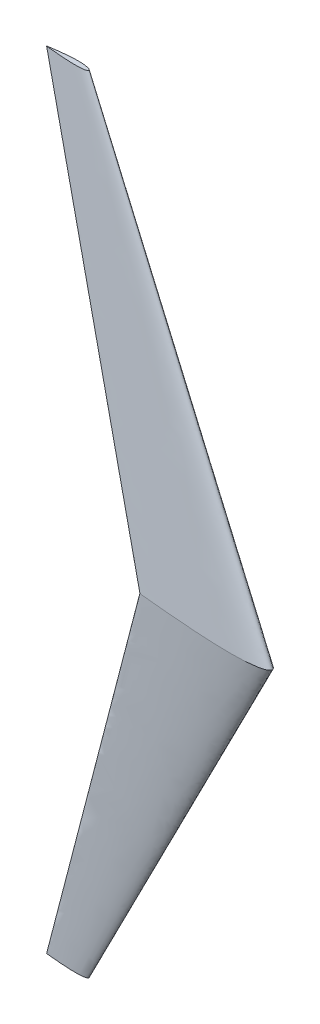
ISO-10303-21;
HEADER;
FILE_DESCRIPTION(('STEP AP214'),'2;1');
FILE_NAME('part.step','',(''),(''),'','','');
FILE_SCHEMA(('AUTOMOTIVE_DESIGN { 1 0 10303 214 1 1 1 1 }'));
ENDSEC;
DATA;
#1=APPLICATION_CONTEXT('core data for automotive mechanical design processes');
#2=APPLICATION_PROTOCOL_DEFINITION('international standard','automotive_design',2000,#1);
#3=PRODUCT_CONTEXT('',#1,'mechanical');
#4=PRODUCT('Part','Part','',(#3));
#5=PRODUCT_RELATED_PRODUCT_CATEGORY('part','',(#4));
#6=PRODUCT_DEFINITION_FORMATION('','',#4);
#7=PRODUCT_DEFINITION_CONTEXT('part definition',#1,'design');
#8=PRODUCT_DEFINITION('design','',#6,#7);
#9=PRODUCT_DEFINITION_SHAPE('','',#8);
#10=(LENGTH_UNIT() NAMED_UNIT(*) SI_UNIT(.MILLI.,.METRE.));
#11=(NAMED_UNIT(*) PLANE_ANGLE_UNIT() SI_UNIT($,.RADIAN.));
#12=(NAMED_UNIT(*) SI_UNIT($,.STERADIAN.) SOLID_ANGLE_UNIT());
#13=UNCERTAINTY_MEASURE_WITH_UNIT(LENGTH_MEASURE(1.E-05),#10,'distance_accuracy_value','');
#14=(GEOMETRIC_REPRESENTATION_CONTEXT(3) GLOBAL_UNCERTAINTY_ASSIGNED_CONTEXT((#13)) GLOBAL_UNIT_ASSIGNED_CONTEXT((#10,
#11,#12)) REPRESENTATION_CONTEXT('',''));
#15=CARTESIAN_POINT('',(0.,0.,0.));
#16=DIRECTION('',(0.,0.,1.));
#17=DIRECTION('',(1.,0.,0.));
#18=AXIS2_PLACEMENT_3D('',#15,#16,#17);
#19=CARTESIAN_POINT('',(-18405.6058100708,33202.771,-2917.06464160294));
#20=DIRECTION('',(0.,1.,-2.34509638159713E-13));
#21=DIRECTION('',(0.,2.34509638159713E-13,1.));
#22=AXIS2_PLACEMENT_3D('',#19,#20,#21);
#23=PLANE('',#22);
#24=CARTESIAN_POINT('',(-21974.7965,33202.771,-2904.86606));
#25=CARTESIAN_POINT('',(-21975.1351964931,33202.771,-2914.94292659192));
#26=CARTESIAN_POINT('',(-21770.9336607975,33202.771,-2941.73019108061));
#27=CARTESIAN_POINT('',(-21575.3277739045,33202.771,-2975.87611007744));
#28=CARTESIAN_POINT('',(-21257.9088104456,33202.771,-3019.83167326614));
#29=CARTESIAN_POINT('',(-20907.5381549963,33202.771,-3063.41624375509));
#30=CARTESIAN_POINT('',(-20548.3977339331,33202.771,-3100.90590726187));
#31=CARTESIAN_POINT('',(-20191.0793635046,33202.771,-3130.16314166895));
#32=CARTESIAN_POINT('',(-19832.36444432,33202.771,-3150.05072832764));
#33=CARTESIAN_POINT('',(-19532.912617963,33202.771,-3155.17850423053));
#34=CARTESIAN_POINT('',(-19293.0982135333,33202.771,-3148.58246246975));
#35=CARTESIAN_POINT('',(-19113.299135708,33202.771,-3137.74273956559));
#36=CARTESIAN_POINT('',(-18933.6599968167,33202.771,-3118.91462294842));
#37=CARTESIAN_POINT('',(-18784.4216632769,33202.771,-3095.01918870406));
#38=CARTESIAN_POINT('',(-18665.6150054188,33202.771,-3067.58938558738));
#39=CARTESIAN_POINT('',(-18576.2696289639,33202.771,-3041.41534581103));
#40=CARTESIAN_POINT('',(-18501.2939608237,33202.771,-3010.16244508229));
#41=CARTESIAN_POINT('',(-18437.1649289684,33202.771,-2973.12503241846));
#42=CARTESIAN_POINT('',(-18382.7081302418,33202.771,-2903.78409775318));
#43=CARTESIAN_POINT('',(-18443.6392229064,33202.771,-2840.34258145812));
#44=CARTESIAN_POINT('',(-18510.5373421066,33202.771,-2809.37071305487));
#45=CARTESIAN_POINT('',(-18587.4165426913,33202.771,-2785.04648233305));
#46=CARTESIAN_POINT('',(-18677.8124440816,33202.771,-2766.46319374919));
#47=CARTESIAN_POINT('',(-18797.0428807729,33202.771,-2748.41807898688));
#48=CARTESIAN_POINT('',(-18945.6137945259,33202.771,-2734.60932638588));
#49=CARTESIAN_POINT('',(-19123.5543355769,33202.771,-2725.94337262178));
#50=CARTESIAN_POINT('',(-19301.0480582149,33202.771,-2722.80977929485));
#51=CARTESIAN_POINT('',(-19537.4258777591,33202.771,-2723.87428639124));
#52=CARTESIAN_POINT('',(-19833.3468784324,33202.771,-2732.16689338585));
#53=CARTESIAN_POINT('',(-20189.0101452973,33202.771,-2749.6327307136));
#54=CARTESIAN_POINT('',(-20544.8133336157,33202.771,-2773.01335441234));
#55=CARTESIAN_POINT('',(-20903.2148502764,33202.771,-2800.43098106479));
#56=CARTESIAN_POINT('',(-21253.8044237475,33202.771,-2830.63231034419));
#57=CARTESIAN_POINT('',(-21572.1764083516,33202.771,-2858.32358394914));
#58=CARTESIAN_POINT('',(-21769.1491064639,33202.771,-2881.36612072614));
#59=CARTESIAN_POINT('',(-21974.4579079654,33202.771,-2894.79230124849));
#60=CARTESIAN_POINT('',(-21974.7965,33202.771,-2904.86606));
#61=B_SPLINE_CURVE_WITH_KNOTS('',3,(#24,#25,#26,#27,#28,#29,#30,#31,#32,#33,#34,#35,#36,#37,#38,
#39,#40,#41,#42,#43,#44,#45,#46,#47,#48,#49,#50,#51,#52,#53,#54,#55,#56,#57,#58,#59,#60),
.UNSPECIFIED.,.T.,.F.,(4,1,1,1,1,1,1,1,1,1,1,1,1,1,1,1,1,1,1,1,1,1,1,1,1,1,1,1,1,1,1,1,1,1,4),
(0.,0.0248642483814227,0.0496246034076385,0.0990948758686006,0.148515074011741,
0.197890555944894,0.247222478915856,0.296497050691517,0.345931654673479,0.370648994613184,
0.395384742264146,0.420172888959639,0.445085585110793,0.457649304487031,0.470385826976966,
0.4835458970638,0.490647605666909,0.501791371338409,0.512925179239209,0.519993048326513,
0.533066058486347,0.545685358570685,0.558124562788478,0.582729648311645,0.607174468672583,
0.63155296092873,0.655907514934716,0.704618452295907,0.753595364629021,0.802651987708249,
0.85180736813702,0.901059775497641,0.950419228357894,0.975143420085264,1.),.UNSPECIFIED.);
#62=CARTESIAN_POINT('',(-21974.7965,33202.771,-2904.86606));
#63=VERTEX_POINT('',#62);
#64=EDGE_CURVE('E11',#63,#63,#61,.T.);
#65=ORIENTED_EDGE('',*,*,#64,.F.);
#66=EDGE_LOOP('',(#65));
#67=FACE_BOUND('',#66,.T.);
#68=ADVANCED_FACE('F56',(#67),#23,.T.);
#69=CARTESIAN_POINT('',(-11186.5699998817,0.,3.32781614764688E-08));
#70=CARTESIAN_POINT('',(-21974.7964999621,33202.771,-2904.8660599281));
#71=CARTESIAN_POINT('',(-11185.5090825551,0.,31.564284047819));
#72=CARTESIAN_POINT('',(-21974.4579076314,33202.771,-2894.79230122665));
#73=CARTESIAN_POINT('',(-10542.2114307166,0.,73.6327706842226));
#74=CARTESIAN_POINT('',(-21769.1491064639,33202.771,-2881.36612072614));
#75=CARTESIAN_POINT('',(-9925.033440107,0.,145.832351574437));
#76=CARTESIAN_POINT('',(-21572.1764083516,33202.771,-2858.32358394914));
#77=CARTESIAN_POINT('',(-8927.47293923458,0.,232.597906204047));
#78=CARTESIAN_POINT('',(-21253.8044237475,33202.771,-2830.63231034419));
#79=CARTESIAN_POINT('',(-7828.96450541495,0.,327.228255226897));
#80=CARTESIAN_POINT('',(-20903.2148502764,33202.771,-2800.43098106479));
#81=CARTESIAN_POINT('',(-6705.97877333685,0.,413.136384276443));
#82=CARTESIAN_POINT('',(-20544.8133336157,33202.771,-2773.01335441234));
#83=CARTESIAN_POINT('',(-5591.13443286942,0.,486.395301946905));
#84=CARTESIAN_POINT('',(-20189.0101452973,33202.771,-2749.6327307136));
#85=CARTESIAN_POINT('',(-4476.72851078791,0.,541.121314032559));
#86=CARTESIAN_POINT('',(-19833.3468784324,33202.771,-2732.16689338585));
#87=CARTESIAN_POINT('',(-3549.51407225918,0.,567.104684481514));
#88=CARTESIAN_POINT('',(-19537.4258777591,33202.771,-2723.87428639124));
#89=CARTESIAN_POINT('',(-2808.86732906503,0.,570.440123358636));
#90=CARTESIAN_POINT('',(-19301.0480582149,33202.771,-2722.80977929485));
#91=CARTESIAN_POINT('',(-2252.72315273353,0.,560.621580176942));
#92=CARTESIAN_POINT('',(-19123.5543355769,33202.771,-2725.94337262178));
#93=CARTESIAN_POINT('',(-1695.17894821236,0.,533.468396405524));
#94=CARTESIAN_POINT('',(-18945.6137945259,33202.771,-2734.60932638588));
#95=CARTESIAN_POINT('',(-1229.65910378213,0.,490.201190349747));
#96=CARTESIAN_POINT('',(-18797.0428807729,33202.771,-2748.41807898688));
#97=CARTESIAN_POINT('',(-856.072290218423,0.,433.660117816483));
#98=CARTESIAN_POINT('',(-18677.8124440816,33202.771,-2766.46319374919));
#99=CARTESIAN_POINT('',(-572.833235786275,0.,375.432777001901));
#100=CARTESIAN_POINT('',(-18587.4165426913,33202.771,-2785.04648233305));
#101=CARTESIAN_POINT('',(-331.946298504047,0.,299.217236284628));
#102=CARTESIAN_POINT('',(-18510.5373421066,33202.771,-2809.37071305487));
#103=CARTESIAN_POINT('',(-122.333258310894,0.,202.172540109516));
#104=CARTESIAN_POINT('',(-18443.6392229064,33202.771,-2840.34258145812));
#105=CARTESIAN_POINT('',(68.5832220394783,0.,3.39012984241294));
#106=CARTESIAN_POINT('',(-18382.7081302418,33202.771,-2903.78409775318));
#107=CARTESIAN_POINT('',(-102.047246785978,0.,-213.877027245668));
#108=CARTESIAN_POINT('',(-18437.1649289684,33202.771,-2973.12503241846));
#109=CARTESIAN_POINT('',(-302.983855265856,0.,-329.926998770543));
#110=CARTESIAN_POINT('',(-18501.2939608237,33202.771,-3010.16244508229));
#111=CARTESIAN_POINT('',(-537.906417434538,0.,-427.852265838175));
#112=CARTESIAN_POINT('',(-18576.2696289639,33202.771,-3041.41534581103));
#113=CARTESIAN_POINT('',(-817.853839121896,0.,-509.863835678021));
#114=CARTESIAN_POINT('',(-18665.6150054188,33202.771,-3067.58938558738));
#115=CARTESIAN_POINT('',(-1190.11281967733,0.,-595.810122679264));
#116=CARTESIAN_POINT('',(-18784.4216632769,33202.771,-3095.01918870406));
#117=CARTESIAN_POINT('',(-1657.72390168984,0.,-670.682096343156));
#118=CARTESIAN_POINT('',(-18933.6599968167,33202.771,-3118.91462294842));
#119=CARTESIAN_POINT('',(-2220.5903514395,0.,-729.676566337209));
#120=CARTESIAN_POINT('',(-19113.299135708,33202.771,-3137.74273956559));
#121=CARTESIAN_POINT('',(-2783.9579355012,0.,-763.640860075471));
#122=CARTESIAN_POINT('',(-19293.0982135333,33202.771,-3148.58246246975));
#123=CARTESIAN_POINT('',(-3535.3725921525,0.,-784.308351911011));
#124=CARTESIAN_POINT('',(-19532.912617963,33202.771,-3155.17850423053));
#125=CARTESIAN_POINT('',(-4473.65022848804,0.,-768.24140292813));
#126=CARTESIAN_POINT('',(-19832.36444432,33202.771,-3150.05072832764));
#127=CARTESIAN_POINT('',(-5597.61795028826,0.,-705.927278910845));
#128=CARTESIAN_POINT('',(-20191.0793635046,33202.771,-3130.16314166895));
#129=CARTESIAN_POINT('',(-6717.20984190424,0.,-614.255077579765));
#130=CARTESIAN_POINT('',(-20548.3977339331,33202.771,-3100.90590726187));
#131=CARTESIAN_POINT('',(-7842.5108026267,0.,-496.788057900726));
#132=CARTESIAN_POINT('',(-20907.5381549963,33202.771,-3063.41624375509));
#133=CARTESIAN_POINT('',(-8940.33329405744,0.,-360.223766123765));
#134=CARTESIAN_POINT('',(-21257.9088104456,33202.771,-3019.83167326614));
#135=CARTESIAN_POINT('',(-9934.90767062734,0.,-222.497029421125));
#136=CARTESIAN_POINT('',(-21575.3277739045,33202.771,-2975.87611007744));
#137=CARTESIAN_POINT('',(-10547.8030063579,0.,-115.507024837908));
#138=CARTESIAN_POINT('',(-21770.9336607975,33202.771,-2941.73019108061));
#139=CARTESIAN_POINT('',(-11187.6312445196,0.,-31.5740221066359));
#140=CARTESIAN_POINT('',(-21975.1351967543,33202.771,-2914.94292655765));
#141=CARTESIAN_POINT('',(-11186.5699998817,0.,3.32781614764688E-08));
#142=CARTESIAN_POINT('',(-21974.7964999621,33202.771,-2904.8660599281));
#143=B_SPLINE_SURFACE_WITH_KNOTS('',3,1,((#69,#70),(#71,#72),(#73,#74),(#75,#76),(#77,#78),(#79,
#80),(#81,#82),(#83,#84),(#85,#86),(#87,#88),(#89,#90),(#91,#92),(#93,#94),(#95,#96),(#97,#98),
(#99,#100),(#101,#102),(#103,#104),(#105,#106),(#107,#108),(#109,#110),(#111,#112),(#113,#114),
(#115,#116),(#117,#118),(#119,#120),(#121,#122),(#123,#124),(#125,#126),(#127,#128),(#129,#130),
(#131,#132),(#133,#134),(#135,#136),(#137,#138),(#139,#140),(#141,#142)),.UNSPECIFIED.,.T.,.F.,
.F.,(4,1,1,1,1,1,1,1,1,1,1,1,1,1,1,1,1,1,1,1,1,1,1,1,1,1,1,1,1,1,1,1,1,1,4),(2,2),(0.,
0.0248565798194605,0.0495807716421064,0.0989402240264194,0.14819263186298,0.197348012291751,
0.246404635217402,0.295381547704093,0.344092485065284,0.368447038983525,0.392825530720844,
0.417270351360761,0.441875437183883,0.454314641429315,0.466933941513653,0.480006951406964,
0.4870748204981,0.498208628661591,0.509352394333091,0.5164541029362,0.529614172770497,
0.542350695267336,0.554914414391254,0.579827111040361,0.604615257735854,0.629351004895691,
0.654068345158602,0.703502949145436,0.75277752066022,0.802109444055106,0.851484925988259,
0.900905124131399,0.950375396592361,0.975135751497463,1.),(0.,1.),.UNSPECIFIED.);
#144=CARTESIAN_POINT('',(-11186.57,0.,0.));
#145=CARTESIAN_POINT('',(-11187.6312442597,0.,-31.5740221407346));
#146=CARTESIAN_POINT('',(-10547.8030063579,0.,-115.507024837908));
#147=CARTESIAN_POINT('',(-9934.90767062734,0.,-222.497029421125));
#148=CARTESIAN_POINT('',(-8940.33329405744,0.,-360.223766123765));
#149=CARTESIAN_POINT('',(-7842.5108026267,0.,-496.788057900726));
#150=CARTESIAN_POINT('',(-6717.20984190424,0.,-614.255077579765));
#151=CARTESIAN_POINT('',(-5597.61795028826,0.,-705.927278910845));
#152=CARTESIAN_POINT('',(-4473.65022848804,0.,-768.24140292813));
#153=CARTESIAN_POINT('',(-3535.3725921525,0.,-784.308351911011));
#154=CARTESIAN_POINT('',(-2783.9579355012,0.,-763.640860075471));
#155=CARTESIAN_POINT('',(-2220.5903514395,0.,-729.676566337209));
#156=CARTESIAN_POINT('',(-1657.72390168984,0.,-670.682096343156));
#157=CARTESIAN_POINT('',(-1190.11281967733,0.,-595.810122679264));
#158=CARTESIAN_POINT('',(-817.853839121896,0.,-509.863835678021));
#159=CARTESIAN_POINT('',(-537.906417434538,0.,-427.852265838175));
#160=CARTESIAN_POINT('',(-302.983855265856,0.,-329.926998770543));
#161=CARTESIAN_POINT('',(-102.047246785978,0.,-213.877027245668));
#162=CARTESIAN_POINT('',(68.5832220394783,0.,3.39012984241294));
#163=CARTESIAN_POINT('',(-122.333258310894,0.,202.172540109516));
#164=CARTESIAN_POINT('',(-331.946298504047,0.,299.217236284628));
#165=CARTESIAN_POINT('',(-572.833235786275,0.,375.432777001901));
#166=CARTESIAN_POINT('',(-856.072290218423,0.,433.660117816483));
#167=CARTESIAN_POINT('',(-1229.65910378213,0.,490.201190349747));
#168=CARTESIAN_POINT('',(-1695.17894821236,0.,533.468396405524));
#169=CARTESIAN_POINT('',(-2252.72315273353,0.,560.621580176942));
#170=CARTESIAN_POINT('',(-2808.86732906503,0.,570.440123358636));
#171=CARTESIAN_POINT('',(-3549.51407225918,0.,567.104684481514));
#172=CARTESIAN_POINT('',(-4476.72851078791,0.,541.121314032559));
#173=CARTESIAN_POINT('',(-5591.13443286942,0.,486.395301946905));
#174=CARTESIAN_POINT('',(-6705.97877333685,0.,413.136384276443));
#175=CARTESIAN_POINT('',(-7828.96450541495,0.,327.228255226897));
#176=CARTESIAN_POINT('',(-8927.47293923458,0.,232.597906204047));
#177=CARTESIAN_POINT('',(-9925.033440107,0.,145.832351574437));
#178=CARTESIAN_POINT('',(-10542.2114307166,0.,73.6327706842226));
#179=CARTESIAN_POINT('',(-11185.5090830515,0.,31.5642840153613));
#180=CARTESIAN_POINT('',(-11186.57,0.,0.));
#181=B_SPLINE_CURVE_WITH_KNOTS('',3,(#144,#145,#146,#147,#148,#149,#150,#151,#152,#153,#154,
#155,#156,#157,#158,#159,#160,#161,#162,#163,#164,#165,#166,#167,#168,#169,#170,#171,#172,#173,
#174,#175,#176,#177,#178,#179,#180),.UNSPECIFIED.,.T.,.F.,(4,1,1,1,1,1,1,1,1,1,1,1,1,1,1,1,1,1,
1,1,1,1,1,1,1,1,1,1,1,1,1,1,1,1,4),(0.,0.0248642485025365,0.0496246033472286,0.0990948750882262,
0.148515073808047,0.197890555767967,0.24722247933978,0.296497050854564,0.345931654841398,
0.370648995104309,0.395384741928235,0.420172888372592,0.445085585608746,0.457649304732664,
0.470385827229503,0.483545896565135,0.490647605172094,0.50179137127,0.5129251795019,
0.519993048593036,0.533066058237418,0.545685358328596,0.558124562816117,0.582729648639239,
0.607174469279156,0.631552961016475,0.655907514769595,0.70461845213527,0.753595364782598,
0.802651987313624,0.851807367769043,0.901059775973581,0.950419228243359,0.975143420180539,1.),.UNSPECIFIED.);
#182=CARTESIAN_POINT('',(-11186.57,0.,0.));
#183=VERTEX_POINT('',#182);
#184=EDGE_CURVE('E66',#183,#183,#181,.T.);
#185=ORIENTED_EDGE('',*,*,#184,.F.);
#186=EDGE_LOOP('',(#185));
#187=FACE_BOUND('',#186,.T.);
#188=ORIENTED_EDGE('',*,*,#64,.T.);
#189=EDGE_LOOP('',(#188));
#190=FACE_BOUND('',#189,.T.);
#191=ADVANCED_FACE('F94',(#187,#190),#143,.T.);
#192=CARTESIAN_POINT('',(-18405.6058100708,-33202.771,-2917.06464160294));
#193=DIRECTION('',(0.,-1.,-2.34509638159713E-13));
#194=DIRECTION('',(0.,-2.34509638159713E-13,1.));
#195=AXIS2_PLACEMENT_3D('',#192,#193,#194);
#196=PLANE('',#195);
#197=CARTESIAN_POINT('',(-21974.7965,-33202.771,-2904.86606));
#198=CARTESIAN_POINT('',(-21975.1351964931,-33202.771,-2914.94292659192));
#199=CARTESIAN_POINT('',(-21770.9336607975,-33202.771,-2941.73019108061));
#200=CARTESIAN_POINT('',(-21575.3277739045,-33202.771,-2975.87611007744));
#201=CARTESIAN_POINT('',(-21257.9088104456,-33202.771,-3019.83167326614));
#202=CARTESIAN_POINT('',(-20907.5381549963,-33202.771,-3063.41624375509));
#203=CARTESIAN_POINT('',(-20548.3977339331,-33202.771,-3100.90590726187));
#204=CARTESIAN_POINT('',(-20191.0793635046,-33202.771,-3130.16314166895));
#205=CARTESIAN_POINT('',(-19832.36444432,-33202.771,-3150.05072832764));
#206=CARTESIAN_POINT('',(-19532.912617963,-33202.771,-3155.17850423053));
#207=CARTESIAN_POINT('',(-19293.0982135333,-33202.771,-3148.58246246975));
#208=CARTESIAN_POINT('',(-19113.299135708,-33202.771,-3137.74273956559));
#209=CARTESIAN_POINT('',(-18933.6599968167,-33202.771,-3118.91462294842));
#210=CARTESIAN_POINT('',(-18784.4216632769,-33202.771,-3095.01918870406));
#211=CARTESIAN_POINT('',(-18665.6150054188,-33202.771,-3067.58938558738));
#212=CARTESIAN_POINT('',(-18576.2696289639,-33202.771,-3041.41534581103));
#213=CARTESIAN_POINT('',(-18501.2939608237,-33202.771,-3010.16244508229));
#214=CARTESIAN_POINT('',(-18437.1649289684,-33202.771,-2973.12503241846));
#215=CARTESIAN_POINT('',(-18382.7081302418,-33202.771,-2903.78409775318));
#216=CARTESIAN_POINT('',(-18443.6392229064,-33202.771,-2840.34258145812));
#217=CARTESIAN_POINT('',(-18510.5373421066,-33202.771,-2809.37071305487));
#218=CARTESIAN_POINT('',(-18587.4165426913,-33202.771,-2785.04648233305));
#219=CARTESIAN_POINT('',(-18677.8124440816,-33202.771,-2766.46319374919));
#220=CARTESIAN_POINT('',(-18797.0428807729,-33202.771,-2748.41807898688));
#221=CARTESIAN_POINT('',(-18945.6137945259,-33202.771,-2734.60932638588));
#222=CARTESIAN_POINT('',(-19123.5543355769,-33202.771,-2725.94337262178));
#223=CARTESIAN_POINT('',(-19301.0480582149,-33202.771,-2722.80977929485));
#224=CARTESIAN_POINT('',(-19537.4258777591,-33202.771,-2723.87428639124));
#225=CARTESIAN_POINT('',(-19833.3468784324,-33202.771,-2732.16689338585));
#226=CARTESIAN_POINT('',(-20189.0101452973,-33202.771,-2749.6327307136));
#227=CARTESIAN_POINT('',(-20544.8133336157,-33202.771,-2773.01335441234));
#228=CARTESIAN_POINT('',(-20903.2148502764,-33202.771,-2800.43098106479));
#229=CARTESIAN_POINT('',(-21253.8044237475,-33202.771,-2830.63231034419));
#230=CARTESIAN_POINT('',(-21572.1764083516,-33202.771,-2858.32358394914));
#231=CARTESIAN_POINT('',(-21769.1491064639,-33202.771,-2881.36612072614));
#232=CARTESIAN_POINT('',(-21974.4579079654,-33202.771,-2894.79230124849));
#233=CARTESIAN_POINT('',(-21974.7965,-33202.771,-2904.86606));
#234=B_SPLINE_CURVE_WITH_KNOTS('',3,(#197,#198,#199,#200,#201,#202,#203,#204,#205,#206,#207,
#208,#209,#210,#211,#212,#213,#214,#215,#216,#217,#218,#219,#220,#221,#222,#223,#224,#225,#226,
#227,#228,#229,#230,#231,#232,#233),.UNSPECIFIED.,.T.,.F.,(4,1,1,1,1,1,1,1,1,1,1,1,1,1,1,1,1,1,
1,1,1,1,1,1,1,1,1,1,1,1,1,1,1,1,4),(0.,0.0248642483814227,0.0496246034076385,0.0990948758686006,
0.148515074011741,0.197890555944894,0.247222478915856,0.296497050691517,0.345931654673479,
0.370648994613184,0.395384742264146,0.420172888959639,0.445085585110793,0.457649304487031,
0.470385826976966,0.4835458970638,0.490647605666909,0.501791371338409,0.512925179239209,
0.519993048326513,0.533066058486347,0.545685358570685,0.558124562788478,0.582729648311645,
0.607174468672583,0.63155296092873,0.655907514934716,0.704618452295907,0.753595364629021,
0.802651987708249,0.85180736813702,0.901059775497641,0.950419228357894,0.975143420085264,1.),.UNSPECIFIED.);
#235=CARTESIAN_POINT('',(-21974.7965,-33202.771,-2904.86606));
#236=VERTEX_POINT('',#235);
#237=EDGE_CURVE('E71',#236,#236,#234,.T.);
#238=ORIENTED_EDGE('',*,*,#237,.T.);
#239=EDGE_LOOP('',(#238));
#240=FACE_BOUND('',#239,.T.);
#241=ADVANCED_FACE('F105',(#240),#196,.T.);
#242=CARTESIAN_POINT('',(-11186.5699998817,0.,3.32781614764688E-08));
#243=CARTESIAN_POINT('',(-21974.7964999621,-33202.771,-2904.8660599281));
#244=CARTESIAN_POINT('',(-11185.5090825551,0.,31.564284047819));
#245=CARTESIAN_POINT('',(-21974.4579076314,-33202.771,-2894.79230122665));
#246=CARTESIAN_POINT('',(-10542.2114307166,0.,73.6327706842226));
#247=CARTESIAN_POINT('',(-21769.1491064639,-33202.771,-2881.36612072614));
#248=CARTESIAN_POINT('',(-9925.033440107,0.,145.832351574437));
#249=CARTESIAN_POINT('',(-21572.1764083516,-33202.771,-2858.32358394914));
#250=CARTESIAN_POINT('',(-8927.47293923458,0.,232.597906204047));
#251=CARTESIAN_POINT('',(-21253.8044237475,-33202.771,-2830.63231034419));
#252=CARTESIAN_POINT('',(-7828.96450541495,0.,327.228255226897));
#253=CARTESIAN_POINT('',(-20903.2148502764,-33202.771,-2800.43098106479));
#254=CARTESIAN_POINT('',(-6705.97877333685,0.,413.136384276443));
#255=CARTESIAN_POINT('',(-20544.8133336157,-33202.771,-2773.01335441234));
#256=CARTESIAN_POINT('',(-5591.13443286942,0.,486.395301946905));
#257=CARTESIAN_POINT('',(-20189.0101452973,-33202.771,-2749.6327307136));
#258=CARTESIAN_POINT('',(-4476.72851078791,0.,541.121314032559));
#259=CARTESIAN_POINT('',(-19833.3468784324,-33202.771,-2732.16689338585));
#260=CARTESIAN_POINT('',(-3549.51407225918,0.,567.104684481514));
#261=CARTESIAN_POINT('',(-19537.4258777591,-33202.771,-2723.87428639124));
#262=CARTESIAN_POINT('',(-2808.86732906503,0.,570.440123358636));
#263=CARTESIAN_POINT('',(-19301.0480582149,-33202.771,-2722.80977929485));
#264=CARTESIAN_POINT('',(-2252.72315273353,0.,560.621580176942));
#265=CARTESIAN_POINT('',(-19123.5543355769,-33202.771,-2725.94337262178));
#266=CARTESIAN_POINT('',(-1695.17894821236,0.,533.468396405524));
#267=CARTESIAN_POINT('',(-18945.6137945259,-33202.771,-2734.60932638588));
#268=CARTESIAN_POINT('',(-1229.65910378213,0.,490.201190349747));
#269=CARTESIAN_POINT('',(-18797.0428807729,-33202.771,-2748.41807898688));
#270=CARTESIAN_POINT('',(-856.072290218423,0.,433.660117816483));
#271=CARTESIAN_POINT('',(-18677.8124440816,-33202.771,-2766.46319374919));
#272=CARTESIAN_POINT('',(-572.833235786275,0.,375.432777001901));
#273=CARTESIAN_POINT('',(-18587.4165426913,-33202.771,-2785.04648233305));
#274=CARTESIAN_POINT('',(-331.946298504047,0.,299.217236284628));
#275=CARTESIAN_POINT('',(-18510.5373421066,-33202.771,-2809.37071305487));
#276=CARTESIAN_POINT('',(-122.333258310894,0.,202.172540109516));
#277=CARTESIAN_POINT('',(-18443.6392229064,-33202.771,-2840.34258145812));
#278=CARTESIAN_POINT('',(68.5832220394783,0.,3.39012984241294));
#279=CARTESIAN_POINT('',(-18382.7081302418,-33202.771,-2903.78409775318));
#280=CARTESIAN_POINT('',(-102.047246785978,0.,-213.877027245668));
#281=CARTESIAN_POINT('',(-18437.1649289684,-33202.771,-2973.12503241846));
#282=CARTESIAN_POINT('',(-302.983855265856,0.,-329.926998770543));
#283=CARTESIAN_POINT('',(-18501.2939608237,-33202.771,-3010.16244508229));
#284=CARTESIAN_POINT('',(-537.906417434538,0.,-427.852265838175));
#285=CARTESIAN_POINT('',(-18576.2696289639,-33202.771,-3041.41534581103));
#286=CARTESIAN_POINT('',(-817.853839121896,0.,-509.863835678021));
#287=CARTESIAN_POINT('',(-18665.6150054188,-33202.771,-3067.58938558738));
#288=CARTESIAN_POINT('',(-1190.11281967733,0.,-595.810122679264));
#289=CARTESIAN_POINT('',(-18784.4216632769,-33202.771,-3095.01918870406));
#290=CARTESIAN_POINT('',(-1657.72390168984,0.,-670.682096343156));
#291=CARTESIAN_POINT('',(-18933.6599968167,-33202.771,-3118.91462294842));
#292=CARTESIAN_POINT('',(-2220.5903514395,0.,-729.676566337209));
#293=CARTESIAN_POINT('',(-19113.299135708,-33202.771,-3137.74273956559));
#294=CARTESIAN_POINT('',(-2783.9579355012,0.,-763.640860075471));
#295=CARTESIAN_POINT('',(-19293.0982135333,-33202.771,-3148.58246246975));
#296=CARTESIAN_POINT('',(-3535.3725921525,0.,-784.308351911011));
#297=CARTESIAN_POINT('',(-19532.912617963,-33202.771,-3155.17850423053));
#298=CARTESIAN_POINT('',(-4473.65022848804,0.,-768.24140292813));
#299=CARTESIAN_POINT('',(-19832.36444432,-33202.771,-3150.05072832764));
#300=CARTESIAN_POINT('',(-5597.61795028826,0.,-705.927278910845));
#301=CARTESIAN_POINT('',(-20191.0793635046,-33202.771,-3130.16314166895));
#302=CARTESIAN_POINT('',(-6717.20984190424,0.,-614.255077579765));
#303=CARTESIAN_POINT('',(-20548.3977339331,-33202.771,-3100.90590726187));
#304=CARTESIAN_POINT('',(-7842.5108026267,0.,-496.788057900726));
#305=CARTESIAN_POINT('',(-20907.5381549963,-33202.771,-3063.41624375509));
#306=CARTESIAN_POINT('',(-8940.33329405744,0.,-360.223766123765));
#307=CARTESIAN_POINT('',(-21257.9088104456,-33202.771,-3019.83167326614));
#308=CARTESIAN_POINT('',(-9934.90767062734,0.,-222.497029421125));
#309=CARTESIAN_POINT('',(-21575.3277739045,-33202.771,-2975.87611007744));
#310=CARTESIAN_POINT('',(-10547.8030063579,0.,-115.507024837908));
#311=CARTESIAN_POINT('',(-21770.9336607975,-33202.771,-2941.73019108061));
#312=CARTESIAN_POINT('',(-11187.6312445196,0.,-31.5740221066359));
#313=CARTESIAN_POINT('',(-21975.1351967543,-33202.771,-2914.94292655765));
#314=CARTESIAN_POINT('',(-11186.5699998817,0.,3.32781614764688E-08));
#315=CARTESIAN_POINT('',(-21974.7964999621,-33202.771,-2904.8660599281));
#316=B_SPLINE_SURFACE_WITH_KNOTS('',3,1,((#242,#243),(#244,#245),(#246,#247),(#248,#249),(#250,
#251),(#252,#253),(#254,#255),(#256,#257),(#258,#259),(#260,#261),(#262,#263),(#264,#265),(#266,
#267),(#268,#269),(#270,#271),(#272,#273),(#274,#275),(#276,#277),(#278,#279),(#280,#281),(#282,
#283),(#284,#285),(#286,#287),(#288,#289),(#290,#291),(#292,#293),(#294,#295),(#296,#297),(#298,
#299),(#300,#301),(#302,#303),(#304,#305),(#306,#307),(#308,#309),(#310,#311),(#312,#313),(#314,
#315)),.UNSPECIFIED.,.T.,.F.,.F.,(4,1,1,1,1,1,1,1,1,1,1,1,1,1,1,1,1,1,1,1,1,1,1,1,1,1,1,1,1,1,1,
1,1,1,4),(2,2),(0.,0.0248565798194605,0.0495807716421064,0.0989402240264194,0.14819263186298,
0.197348012291751,0.246404635217402,0.295381547704093,0.344092485065284,0.368447038983525,
0.392825530720844,0.417270351360761,0.441875437183883,0.454314641429315,0.466933941513653,
0.480006951406964,0.4870748204981,0.498208628661591,0.509352394333091,0.5164541029362,
0.529614172770497,0.542350695267336,0.554914414391254,0.579827111040361,0.604615257735854,
0.629351004895691,0.654068345158602,0.703502949145436,0.75277752066022,0.802109444055106,
0.851484925988259,0.900905124131399,0.950375396592361,0.975135751497463,1.),(0.,1.),.UNSPECIFIED.);
#317=ORIENTED_EDGE('',*,*,#184,.T.);
#318=EDGE_LOOP('',(#317));
#319=FACE_BOUND('',#318,.T.);
#320=ORIENTED_EDGE('',*,*,#237,.F.);
#321=EDGE_LOOP('',(#320));
#322=FACE_BOUND('',#321,.T.);
#323=ADVANCED_FACE('F149',(#319,#322),#316,.F.);
#324=CLOSED_SHELL('',(#68,#191,#241,#323));
#325=MANIFOLD_SOLID_BREP('B2',#324);
#326=ADVANCED_BREP_SHAPE_REPRESENTATION('',(#18,#325),#14);
#327=SHAPE_DEFINITION_REPRESENTATION(#9,#326);
ENDSEC;
END-ISO-10303-21;
